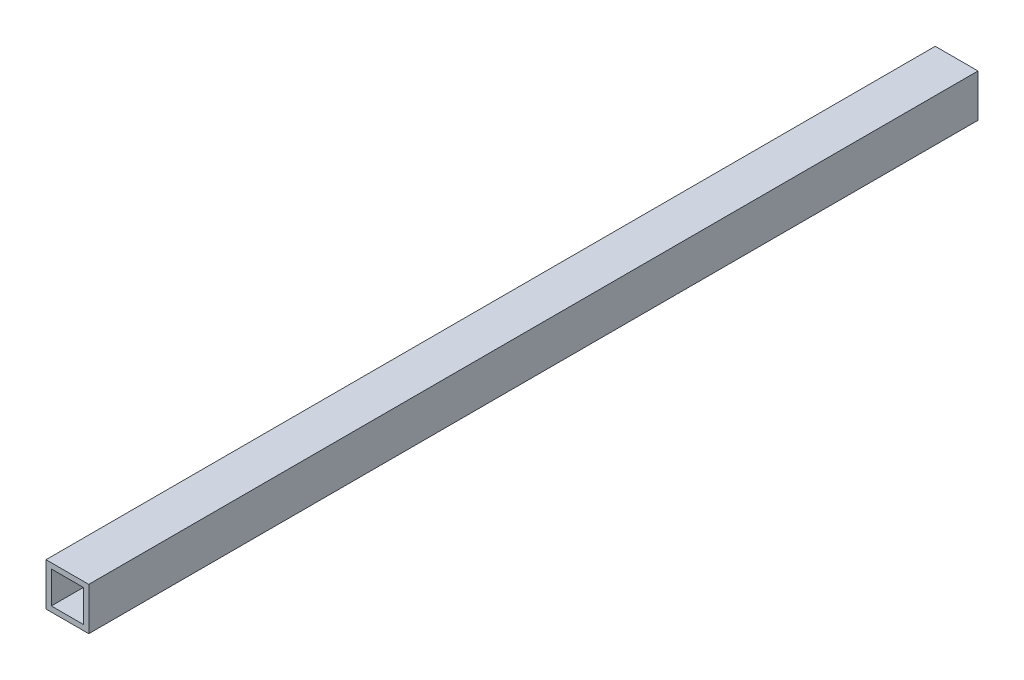
ISO-10303-21;
HEADER;
FILE_DESCRIPTION(('STEP AP214'),'2;1');
FILE_NAME('part.step','',(''),(''),'','','');
FILE_SCHEMA(('AUTOMOTIVE_DESIGN { 1 0 10303 214 1 1 1 1 }'));
ENDSEC;
DATA;
#1=APPLICATION_CONTEXT('core data for automotive mechanical design processes');
#2=APPLICATION_PROTOCOL_DEFINITION('international standard','automotive_design',2000,#1);
#3=PRODUCT_CONTEXT('',#1,'mechanical');
#4=PRODUCT('Part','Part','',(#3));
#5=PRODUCT_RELATED_PRODUCT_CATEGORY('part','',(#4));
#6=PRODUCT_DEFINITION_FORMATION('','',#4);
#7=PRODUCT_DEFINITION_CONTEXT('part definition',#1,'design');
#8=PRODUCT_DEFINITION('design','',#6,#7);
#9=PRODUCT_DEFINITION_SHAPE('','',#8);
#10=(LENGTH_UNIT() NAMED_UNIT(*) SI_UNIT(.MILLI.,.METRE.));
#11=(NAMED_UNIT(*) PLANE_ANGLE_UNIT() SI_UNIT($,.RADIAN.));
#12=(NAMED_UNIT(*) SI_UNIT($,.STERADIAN.) SOLID_ANGLE_UNIT());
#13=UNCERTAINTY_MEASURE_WITH_UNIT(LENGTH_MEASURE(1.E-05),#10,'distance_accuracy_value','');
#14=(GEOMETRIC_REPRESENTATION_CONTEXT(3) GLOBAL_UNCERTAINTY_ASSIGNED_CONTEXT((#13)) GLOBAL_UNIT_ASSIGNED_CONTEXT((#10,
#11,#12)) REPRESENTATION_CONTEXT('',''));
#15=CARTESIAN_POINT('',(0.,0.,0.));
#16=DIRECTION('',(0.,0.,1.));
#17=DIRECTION('',(1.,0.,0.));
#18=AXIS2_PLACEMENT_3D('',#15,#16,#17);
#19=CARTESIAN_POINT('',(0.,0.,264.16));
#20=DIRECTION('',(0.,0.,1.));
#21=DIRECTION('',(1.,0.,0.));
#22=AXIS2_PLACEMENT_3D('',#19,#20,#21);
#23=PLANE('',#22);
#24=DIRECTION('',(0.,-1.,0.));
#25=VECTOR('',#24,1.);
#26=CARTESIAN_POINT('',(-12.7,-12.7,264.16));
#27=LINE('',#26,#25);
#28=CARTESIAN_POINT('',(-12.7,12.7,264.16));
#29=VERTEX_POINT('',#28);
#30=CARTESIAN_POINT('',(-12.7,-12.7,264.16));
#31=VERTEX_POINT('',#30);
#32=EDGE_CURVE('E117',#29,#31,#27,.T.);
#33=ORIENTED_EDGE('',*,*,#32,.T.);
#34=DIRECTION('',(1.,0.,0.));
#35=VECTOR('',#34,1.);
#36=CARTESIAN_POINT('',(12.7,-12.7,264.16));
#37=LINE('',#36,#35);
#38=CARTESIAN_POINT('',(12.7,-12.7,264.16));
#39=VERTEX_POINT('',#38);
#40=EDGE_CURVE('E176',#31,#39,#37,.T.);
#41=ORIENTED_EDGE('',*,*,#40,.T.);
#42=DIRECTION('',(0.,1.,0.));
#43=VECTOR('',#42,1.);
#44=CARTESIAN_POINT('',(12.7,-12.7,264.16));
#45=LINE('',#44,#43);
#46=CARTESIAN_POINT('',(12.7,12.7,264.16));
#47=VERTEX_POINT('',#46);
#48=EDGE_CURVE('E179',#39,#47,#45,.T.);
#49=ORIENTED_EDGE('',*,*,#48,.T.);
#50=DIRECTION('',(-1.,0.,0.));
#51=VECTOR('',#50,1.);
#52=CARTESIAN_POINT('',(12.7,12.7,264.16));
#53=LINE('',#52,#51);
#54=EDGE_CURVE('E63',#47,#29,#53,.T.);
#55=ORIENTED_EDGE('',*,*,#54,.T.);
#56=EDGE_LOOP('',(#33,#41,#49,#55));
#57=FACE_BOUND('',#56,.T.);
#58=DIRECTION('',(1.,0.,0.));
#59=VECTOR('',#58,1.);
#60=CARTESIAN_POINT('',(9.525,-9.525,264.16));
#61=LINE('',#60,#59);
#62=CARTESIAN_POINT('',(-9.52499999999999,-9.525,264.16));
#63=VERTEX_POINT('',#62);
#64=CARTESIAN_POINT('',(9.525,-9.525,264.16));
#65=VERTEX_POINT('',#64);
#66=EDGE_CURVE('E158',#63,#65,#61,.T.);
#67=ORIENTED_EDGE('',*,*,#66,.F.);
#68=DIRECTION('',(0.,-1.,0.));
#69=VECTOR('',#68,1.);
#70=CARTESIAN_POINT('',(-9.52499999999999,-9.525,264.16));
#71=LINE('',#70,#69);
#72=CARTESIAN_POINT('',(-9.52499999999999,9.525,264.16));
#73=VERTEX_POINT('',#72);
#74=EDGE_CURVE('E113',#73,#63,#71,.T.);
#75=ORIENTED_EDGE('',*,*,#74,.F.);
#76=DIRECTION('',(-1.,0.,0.));
#77=VECTOR('',#76,1.);
#78=CARTESIAN_POINT('',(9.525,9.525,264.16));
#79=LINE('',#78,#77);
#80=CARTESIAN_POINT('',(9.525,9.525,264.16));
#81=VERTEX_POINT('',#80);
#82=EDGE_CURVE('E164',#81,#73,#79,.T.);
#83=ORIENTED_EDGE('',*,*,#82,.F.);
#84=DIRECTION('',(0.,1.,0.));
#85=VECTOR('',#84,1.);
#86=CARTESIAN_POINT('',(9.525,-9.525,264.16));
#87=LINE('',#86,#85);
#88=EDGE_CURVE('E161',#65,#81,#87,.T.);
#89=ORIENTED_EDGE('',*,*,#88,.F.);
#90=EDGE_LOOP('',(#67,#75,#83,#89));
#91=FACE_BOUND('',#90,.T.);
#92=ADVANCED_FACE('F39',(#57,#91),#23,.T.);
#93=CARTESIAN_POINT('',(-12.7,-12.7,264.16));
#94=DIRECTION('',(1.,0.,0.));
#95=DIRECTION('',(0.,0.,-1.));
#96=AXIS2_PLACEMENT_3D('',#93,#94,#95);
#97=PLANE('',#96);
#98=DIRECTION('',(0.,0.,-1.));
#99=VECTOR('',#98,1.);
#100=CARTESIAN_POINT('',(-12.7,12.7,264.16));
#101=LINE('',#100,#99);
#102=CARTESIAN_POINT('',(-12.7,12.7,-264.16));
#103=VERTEX_POINT('',#102);
#104=EDGE_CURVE('E184',#29,#103,#101,.T.);
#105=ORIENTED_EDGE('',*,*,#104,.T.);
#106=DIRECTION('',(0.,-1.,0.));
#107=VECTOR('',#106,1.);
#108=CARTESIAN_POINT('',(-12.7,-12.7,-264.16));
#109=LINE('',#108,#107);
#110=CARTESIAN_POINT('',(-12.7,-12.7,-264.16));
#111=VERTEX_POINT('',#110);
#112=EDGE_CURVE('E140',#103,#111,#109,.T.);
#113=ORIENTED_EDGE('',*,*,#112,.T.);
#114=DIRECTION('',(0.,0.,-1.));
#115=VECTOR('',#114,1.);
#116=CARTESIAN_POINT('',(-12.7,-12.7,264.16));
#117=LINE('',#116,#115);
#118=EDGE_CURVE('E11',#31,#111,#117,.T.);
#119=ORIENTED_EDGE('',*,*,#118,.F.);
#120=ORIENTED_EDGE('',*,*,#32,.F.);
#121=EDGE_LOOP('',(#105,#113,#119,#120));
#122=FACE_BOUND('',#121,.T.);
#123=ADVANCED_FACE('F41',(#122),#97,.F.);
#124=CARTESIAN_POINT('',(12.7,-12.7,264.16));
#125=DIRECTION('',(0.,1.,0.));
#126=DIRECTION('',(0.,0.,1.));
#127=AXIS2_PLACEMENT_3D('',#124,#125,#126);
#128=PLANE('',#127);
#129=ORIENTED_EDGE('',*,*,#118,.T.);
#130=DIRECTION('',(1.,0.,0.));
#131=VECTOR('',#130,1.);
#132=CARTESIAN_POINT('',(12.7,-12.7,-264.16));
#133=LINE('',#132,#131);
#134=CARTESIAN_POINT('',(12.7,-12.7,-264.16));
#135=VERTEX_POINT('',#134);
#136=EDGE_CURVE('E144',#111,#135,#133,.T.);
#137=ORIENTED_EDGE('',*,*,#136,.T.);
#138=DIRECTION('',(0.,0.,-1.));
#139=VECTOR('',#138,1.);
#140=CARTESIAN_POINT('',(12.7,-12.7,264.16));
#141=LINE('',#140,#139);
#142=EDGE_CURVE('E48',#39,#135,#141,.T.);
#143=ORIENTED_EDGE('',*,*,#142,.F.);
#144=ORIENTED_EDGE('',*,*,#40,.F.);
#145=EDGE_LOOP('',(#129,#137,#143,#144));
#146=FACE_BOUND('',#145,.T.);
#147=ADVANCED_FACE('F200',(#146),#128,.F.);
#148=CARTESIAN_POINT('',(12.7,-12.7,264.16));
#149=DIRECTION('',(-1.,0.,0.));
#150=DIRECTION('',(0.,0.,1.));
#151=AXIS2_PLACEMENT_3D('',#148,#149,#150);
#152=PLANE('',#151);
#153=ORIENTED_EDGE('',*,*,#142,.T.);
#154=DIRECTION('',(0.,1.,0.));
#155=VECTOR('',#154,1.);
#156=CARTESIAN_POINT('',(12.7,-12.7,-264.16));
#157=LINE('',#156,#155);
#158=CARTESIAN_POINT('',(12.7,12.7,-264.16));
#159=VERTEX_POINT('',#158);
#160=EDGE_CURVE('E148',#135,#159,#157,.T.);
#161=ORIENTED_EDGE('',*,*,#160,.T.);
#162=DIRECTION('',(0.,0.,-1.));
#163=VECTOR('',#162,1.);
#164=CARTESIAN_POINT('',(12.7,12.7,264.16));
#165=LINE('',#164,#163);
#166=EDGE_CURVE('E187',#47,#159,#165,.T.);
#167=ORIENTED_EDGE('',*,*,#166,.F.);
#168=ORIENTED_EDGE('',*,*,#48,.F.);
#169=EDGE_LOOP('',(#153,#161,#167,#168));
#170=FACE_BOUND('',#169,.T.);
#171=ADVANCED_FACE('F194',(#170),#152,.F.);
#172=CARTESIAN_POINT('',(12.7,12.7,264.16));
#173=DIRECTION('',(0.,-1.,0.));
#174=DIRECTION('',(0.,0.,-1.));
#175=AXIS2_PLACEMENT_3D('',#172,#173,#174);
#176=PLANE('',#175);
#177=ORIENTED_EDGE('',*,*,#166,.T.);
#178=DIRECTION('',(-1.,0.,0.));
#179=VECTOR('',#178,1.);
#180=CARTESIAN_POINT('',(12.7,12.7,-264.16));
#181=LINE('',#180,#179);
#182=EDGE_CURVE('E152',#159,#103,#181,.T.);
#183=ORIENTED_EDGE('',*,*,#182,.T.);
#184=ORIENTED_EDGE('',*,*,#104,.F.);
#185=ORIENTED_EDGE('',*,*,#54,.F.);
#186=EDGE_LOOP('',(#177,#183,#184,#185));
#187=FACE_BOUND('',#186,.T.);
#188=ADVANCED_FACE('F205',(#187),#176,.F.);
#189=CARTESIAN_POINT('',(-9.52499999999999,-9.525,264.16));
#190=DIRECTION('',(1.,0.,0.));
#191=DIRECTION('',(0.,0.,-1.));
#192=AXIS2_PLACEMENT_3D('',#189,#190,#191);
#193=PLANE('',#192);
#194=DIRECTION('',(0.,0.,-1.));
#195=VECTOR('',#194,1.);
#196=CARTESIAN_POINT('',(-9.52499999999999,-9.525,264.16));
#197=LINE('',#196,#195);
#198=CARTESIAN_POINT('',(-9.52499999999999,-9.525,-264.16));
#199=VERTEX_POINT('',#198);
#200=EDGE_CURVE('E105',#63,#199,#197,.T.);
#201=ORIENTED_EDGE('',*,*,#200,.T.);
#202=DIRECTION('',(0.,-1.,0.));
#203=VECTOR('',#202,1.);
#204=CARTESIAN_POINT('',(-9.52499999999999,-9.525,-264.16));
#205=LINE('',#204,#203);
#206=CARTESIAN_POINT('',(-9.52499999999999,9.525,-264.16));
#207=VERTEX_POINT('',#206);
#208=EDGE_CURVE('E110',#207,#199,#205,.T.);
#209=ORIENTED_EDGE('',*,*,#208,.F.);
#210=DIRECTION('',(0.,0.,-1.));
#211=VECTOR('',#210,1.);
#212=CARTESIAN_POINT('',(-9.52499999999999,9.525,264.16));
#213=LINE('',#212,#211);
#214=EDGE_CURVE('E167',#73,#207,#213,.T.);
#215=ORIENTED_EDGE('',*,*,#214,.F.);
#216=ORIENTED_EDGE('',*,*,#74,.T.);
#217=EDGE_LOOP('',(#201,#209,#215,#216));
#218=FACE_BOUND('',#217,.T.);
#219=ADVANCED_FACE('F107',(#218),#193,.T.);
#220=CARTESIAN_POINT('',(9.525,-9.525,264.16));
#221=DIRECTION('',(0.,1.,0.));
#222=DIRECTION('',(0.,0.,1.));
#223=AXIS2_PLACEMENT_3D('',#220,#221,#222);
#224=PLANE('',#223);
#225=DIRECTION('',(0.,0.,-1.));
#226=VECTOR('',#225,1.);
#227=CARTESIAN_POINT('',(9.525,-9.525,264.16));
#228=LINE('',#227,#226);
#229=CARTESIAN_POINT('',(9.525,-9.525,-264.16));
#230=VERTEX_POINT('',#229);
#231=EDGE_CURVE('E118',#65,#230,#228,.T.);
#232=ORIENTED_EDGE('',*,*,#231,.T.);
#233=DIRECTION('',(1.,0.,0.));
#234=VECTOR('',#233,1.);
#235=CARTESIAN_POINT('',(9.525,-9.525,-264.16));
#236=LINE('',#235,#234);
#237=EDGE_CURVE('E121',#199,#230,#236,.T.);
#238=ORIENTED_EDGE('',*,*,#237,.F.);
#239=ORIENTED_EDGE('',*,*,#200,.F.);
#240=ORIENTED_EDGE('',*,*,#66,.T.);
#241=EDGE_LOOP('',(#232,#238,#239,#240));
#242=FACE_BOUND('',#241,.T.);
#243=ADVANCED_FACE('F122',(#242),#224,.T.);
#244=CARTESIAN_POINT('',(9.525,-9.525,264.16));
#245=DIRECTION('',(-1.,0.,0.));
#246=DIRECTION('',(0.,0.,1.));
#247=AXIS2_PLACEMENT_3D('',#244,#245,#246);
#248=PLANE('',#247);
#249=DIRECTION('',(0.,0.,-1.));
#250=VECTOR('',#249,1.);
#251=CARTESIAN_POINT('',(9.525,9.525,264.16));
#252=LINE('',#251,#250);
#253=CARTESIAN_POINT('',(9.525,9.525,-264.16));
#254=VERTEX_POINT('',#253);
#255=EDGE_CURVE('E55',#81,#254,#252,.T.);
#256=ORIENTED_EDGE('',*,*,#255,.T.);
#257=DIRECTION('',(0.,1.,0.));
#258=VECTOR('',#257,1.);
#259=CARTESIAN_POINT('',(9.525,-9.525,-264.16));
#260=LINE('',#259,#258);
#261=EDGE_CURVE('E128',#230,#254,#260,.T.);
#262=ORIENTED_EDGE('',*,*,#261,.F.);
#263=ORIENTED_EDGE('',*,*,#231,.F.);
#264=ORIENTED_EDGE('',*,*,#88,.T.);
#265=EDGE_LOOP('',(#256,#262,#263,#264));
#266=FACE_BOUND('',#265,.T.);
#267=ADVANCED_FACE('F223',(#266),#248,.T.);
#268=CARTESIAN_POINT('',(9.525,9.525,264.16));
#269=DIRECTION('',(0.,-1.,0.));
#270=DIRECTION('',(0.,0.,-1.));
#271=AXIS2_PLACEMENT_3D('',#268,#269,#270);
#272=PLANE('',#271);
#273=ORIENTED_EDGE('',*,*,#214,.T.);
#274=DIRECTION('',(-1.,0.,0.));
#275=VECTOR('',#274,1.);
#276=CARTESIAN_POINT('',(9.525,9.525,-264.16));
#277=LINE('',#276,#275);
#278=EDGE_CURVE('E132',#254,#207,#277,.T.);
#279=ORIENTED_EDGE('',*,*,#278,.F.);
#280=ORIENTED_EDGE('',*,*,#255,.F.);
#281=ORIENTED_EDGE('',*,*,#82,.T.);
#282=EDGE_LOOP('',(#273,#279,#280,#281));
#283=FACE_BOUND('',#282,.T.);
#284=ADVANCED_FACE('F226',(#283),#272,.T.);
#285=CARTESIAN_POINT('',(0.,0.,-264.16));
#286=DIRECTION('',(0.,0.,1.));
#287=DIRECTION('',(1.,0.,0.));
#288=AXIS2_PLACEMENT_3D('',#285,#286,#287);
#289=PLANE('',#288);
#290=ORIENTED_EDGE('',*,*,#278,.T.);
#291=ORIENTED_EDGE('',*,*,#208,.T.);
#292=ORIENTED_EDGE('',*,*,#237,.T.);
#293=ORIENTED_EDGE('',*,*,#261,.T.);
#294=EDGE_LOOP('',(#290,#291,#292,#293));
#295=FACE_BOUND('',#294,.T.);
#296=ORIENTED_EDGE('',*,*,#112,.F.);
#297=ORIENTED_EDGE('',*,*,#182,.F.);
#298=ORIENTED_EDGE('',*,*,#160,.F.);
#299=ORIENTED_EDGE('',*,*,#136,.F.);
#300=EDGE_LOOP('',(#296,#297,#298,#299));
#301=FACE_BOUND('',#300,.T.);
#302=ADVANCED_FACE('F130',(#295,#301),#289,.F.);
#303=CLOSED_SHELL('',(#92,#123,#147,#171,#188,#219,#243,#267,#284,#302));
#304=MANIFOLD_SOLID_BREP('B2',#303);
#305=ADVANCED_BREP_SHAPE_REPRESENTATION('',(#18,#304),#14);
#306=SHAPE_DEFINITION_REPRESENTATION(#9,#305);
ENDSEC;
END-ISO-10303-21;
